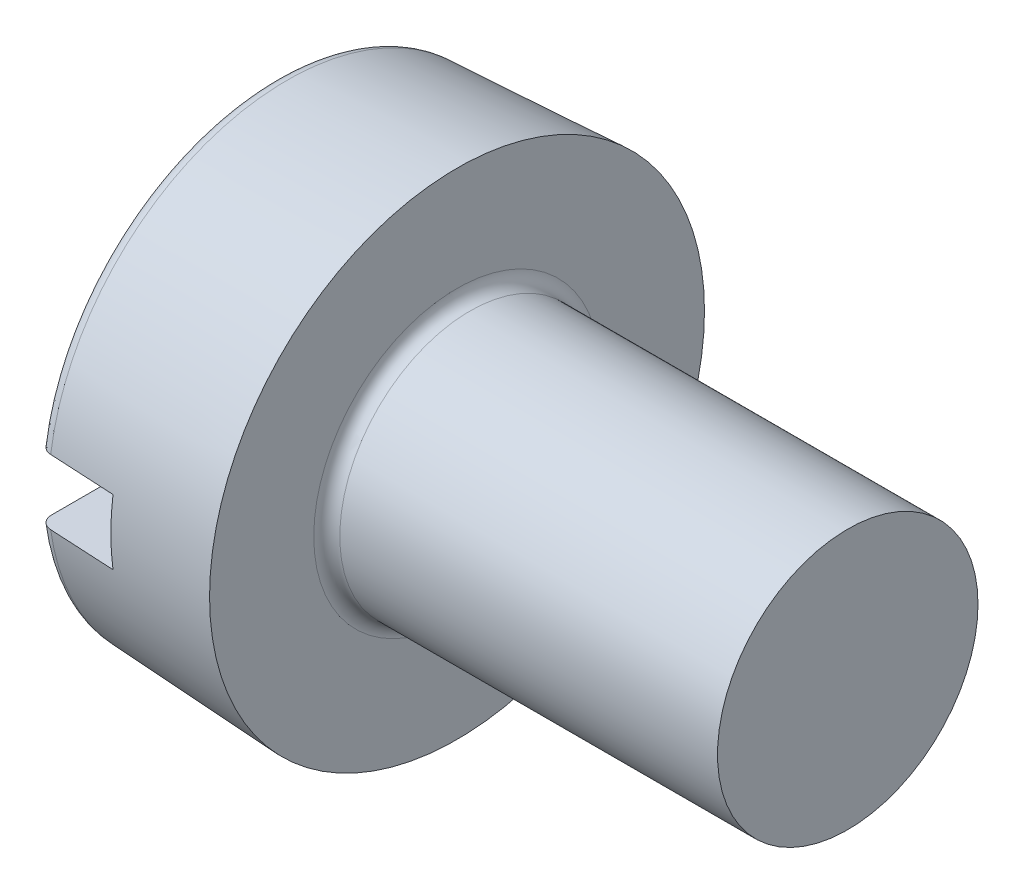
ISO-10303-21;
HEADER;
FILE_DESCRIPTION(('STEP AP214'),'2;1');
FILE_NAME('part.step','',(''),(''),'','','');
FILE_SCHEMA(('AUTOMOTIVE_DESIGN { 1 0 10303 214 1 1 1 1 }'));
ENDSEC;
DATA;
#1=APPLICATION_CONTEXT('core data for automotive mechanical design processes');
#2=APPLICATION_PROTOCOL_DEFINITION('international standard','automotive_design',2000,#1);
#3=PRODUCT_CONTEXT('',#1,'mechanical');
#4=PRODUCT('Part','Part','',(#3));
#5=PRODUCT_RELATED_PRODUCT_CATEGORY('part','',(#4));
#6=PRODUCT_DEFINITION_FORMATION('','',#4);
#7=PRODUCT_DEFINITION_CONTEXT('part definition',#1,'design');
#8=PRODUCT_DEFINITION('design','',#6,#7);
#9=PRODUCT_DEFINITION_SHAPE('','',#8);
#10=(LENGTH_UNIT() NAMED_UNIT(*) SI_UNIT(.MILLI.,.METRE.));
#11=(NAMED_UNIT(*) PLANE_ANGLE_UNIT() SI_UNIT($,.RADIAN.));
#12=(NAMED_UNIT(*) SI_UNIT($,.STERADIAN.) SOLID_ANGLE_UNIT());
#13=UNCERTAINTY_MEASURE_WITH_UNIT(LENGTH_MEASURE(1.E-05),#10,'distance_accuracy_value','');
#14=(GEOMETRIC_REPRESENTATION_CONTEXT(3) GLOBAL_UNCERTAINTY_ASSIGNED_CONTEXT((#13)) GLOBAL_UNIT_ASSIGNED_CONTEXT((#10,
#11,#12)) REPRESENTATION_CONTEXT('',''));
#15=CARTESIAN_POINT('',(0.,0.,0.));
#16=DIRECTION('',(0.,0.,1.));
#17=DIRECTION('',(1.,0.,0.));
#18=AXIS2_PLACEMENT_3D('',#15,#16,#17);
#19=CARTESIAN_POINT('',(0.,0.,0.));
#20=DIRECTION('',(1.,0.,0.));
#21=DIRECTION('',(0.,0.,-1.));
#22=AXIS2_PLACEMENT_3D('',#19,#20,#21);
#23=PLANE('',#22);
#24=DIRECTION('',(0.,0.,-1.));
#25=VECTOR('',#24,1.);
#26=CARTESIAN_POINT('',(0.,-0.25,0.));
#27=LINE('',#26,#25);
#28=CARTESIAN_POINT('',(0.,-0.25,1.71359212741939));
#29=VERTEX_POINT('',#28);
#30=CARTESIAN_POINT('',(0.,-0.25,-1.71359212741939));
#31=VERTEX_POINT('',#30);
#32=EDGE_CURVE('E123',#29,#31,#27,.T.);
#33=ORIENTED_EDGE('',*,*,#32,.T.);
#34=CARTESIAN_POINT('',(0.,0.,0.));
#35=DIRECTION('',(1.,0.,0.));
#36=DIRECTION('',(0.,0.,-1.));
#37=AXIS2_PLACEMENT_3D('',#34,#35,#36);
#38=CIRCLE('',#37,1.73173265233225);
#39=EDGE_CURVE('E212',#31,#29,#38,.F.);
#40=ORIENTED_EDGE('',*,*,#39,.T.);
#41=EDGE_LOOP('',(#33,#40));
#42=FACE_BOUND('',#41,.T.);
#43=ADVANCED_FACE('F43',(#42),#23,.F.);
#44=CARTESIAN_POINT('',(1.4,0.,0.));
#45=DIRECTION('',(1.,0.,0.));
#46=DIRECTION('',(0.,0.,-1.));
#47=AXIS2_PLACEMENT_3D('',#44,#45,#46);
#48=PLANE('',#47);
#49=CARTESIAN_POINT('',(1.4,0.,0.));
#50=DIRECTION('',(1.,0.,0.));
#51=DIRECTION('',(0.,0.,-1.));
#52=AXIS2_PLACEMENT_3D('',#49,#50,#51);
#53=CIRCLE('',#52,1.1);
#54=CARTESIAN_POINT('',(1.4,0.,-1.1));
#55=VERTEX_POINT('',#54);
#56=EDGE_CURVE('E133',#55,#55,#53,.F.);
#57=ORIENTED_EDGE('',*,*,#56,.T.);
#58=EDGE_LOOP('',(#57));
#59=FACE_BOUND('',#58,.T.);
#60=CARTESIAN_POINT('',(1.4,0.,0.));
#61=DIRECTION('',(1.,0.,0.));
#62=DIRECTION('',(0.,0.,-1.));
#63=AXIS2_PLACEMENT_3D('',#60,#61,#62);
#64=CIRCLE('',#63,1.9);
#65=CARTESIAN_POINT('',(1.4,0.,-1.9));
#66=VERTEX_POINT('',#65);
#67=EDGE_CURVE('E242',#66,#66,#64,.T.);
#68=ORIENTED_EDGE('',*,*,#67,.T.);
#69=EDGE_LOOP('',(#68));
#70=FACE_BOUND('',#69,.T.);
#71=ADVANCED_FACE('F186',(#59,#70),#48,.T.);
#72=CARTESIAN_POINT('',(1.4,0.,0.));
#73=DIRECTION('',(1.,0.,0.));
#74=DIRECTION('',(0.,0.,-1.));
#75=AXIS2_PLACEMENT_3D('',#72,#73,#74);
#76=CONICAL_SURFACE('',#75,1.9,0.05235987755983);
#77=CARTESIAN_POINT('',(-3.21567537978676,-0.25,1.63914751477753));
#78=CARTESIAN_POINT('',(-2.05086502036169,-0.25,1.70088544535187));
#79=CARTESIAN_POINT('',(-0.886051593062713,-0.25,1.76256538506105));
#80=CARTESIAN_POINT('',(1.4435813966979,-0.25,1.88580928271814));
#81=CARTESIAN_POINT('',(2.60840095915954,-0.25,1.94737324066612));
#82=CARTESIAN_POINT('',(3.77322358949508,-0.25,2.00887920774899));
#83=B_SPLINE_CURVE_WITH_KNOTS('',3,(#77,#78,#79,#80,#81,#82),.UNSPECIFIED.,.F.,.F.,(4,2,4),(0.,
3.49933602536346,6.99867204896907),.UNSPECIFIED.);
#84=CARTESIAN_POINT('',(0.0947664043757051,-0.25,1.81445376441896));
#85=VERTEX_POINT('',#84);
#86=CARTESIAN_POINT('',(0.600000000000001,-0.25,1.84117847021693));
#87=VERTEX_POINT('',#86);
#88=EDGE_CURVE('E104',#85,#87,#83,.T.);
#89=ORIENTED_EDGE('',*,*,#88,.F.);
#90=CARTESIAN_POINT('',(0.0947664043757056,0.,0.));
#91=DIRECTION('',(1.,0.,0.));
#92=DIRECTION('',(0.,0.,-1.));
#93=AXIS2_PLACEMENT_3D('',#90,#91,#92);
#94=CIRCLE('',#93,1.83159560580771);
#95=CARTESIAN_POINT('',(0.0947664043757057,-0.25,-1.81445376441896));
#96=VERTEX_POINT('',#95);
#97=EDGE_CURVE('E138',#85,#96,#94,.T.);
#98=ORIENTED_EDGE('',*,*,#97,.T.);
#99=CARTESIAN_POINT('',(3.77322358949508,-0.25,-2.00887920774899));
#100=CARTESIAN_POINT('',(2.60840095915954,-0.25,-1.94737324066612));
#101=CARTESIAN_POINT('',(1.4435813966979,-0.25,-1.88580928271814));
#102=CARTESIAN_POINT('',(-0.886051593062713,-0.25,-1.76256538506105));
#103=CARTESIAN_POINT('',(-2.05086502036169,-0.25,-1.70088544535187));
#104=CARTESIAN_POINT('',(-3.21567537978676,-0.25,-1.63914751477753));
#105=B_SPLINE_CURVE_WITH_KNOTS('',3,(#99,#100,#101,#102,#103,#104),.UNSPECIFIED.,.F.,.F.,(4,2,
4),(0.,3.4993360236056,6.99867204896907),.UNSPECIFIED.);
#106=CARTESIAN_POINT('',(0.600000000000001,-0.25,-1.84117847021693));
#107=VERTEX_POINT('',#106);
#108=EDGE_CURVE('E122',#107,#96,#105,.T.);
#109=ORIENTED_EDGE('',*,*,#108,.F.);
#110=CARTESIAN_POINT('',(0.600000000000001,0.,0.));
#111=DIRECTION('',(1.,0.,0.));
#112=DIRECTION('',(0.,0.,-1.));
#113=AXIS2_PLACEMENT_3D('',#110,#111,#112);
#114=CIRCLE('',#113,1.85807377657357);
#115=CARTESIAN_POINT('',(0.600000000000001,0.250000000000001,-1.84117847021693));
#116=VERTEX_POINT('',#115);
#117=EDGE_CURVE('E110',#116,#107,#114,.F.);
#118=ORIENTED_EDGE('',*,*,#117,.F.);
#119=CARTESIAN_POINT('',(-3.21567537978676,0.249999999999998,-1.63914751477753));
#120=CARTESIAN_POINT('',(-2.05086502036169,0.249999999999999,-1.70088544535187));
#121=CARTESIAN_POINT('',(-0.886051593062713,0.25,-1.76256538506105));
#122=CARTESIAN_POINT('',(1.4435813966979,0.250000000000001,-1.88580928271814));
#123=CARTESIAN_POINT('',(2.60840095915954,0.250000000000002,-1.94737324066612));
#124=CARTESIAN_POINT('',(3.77322358949508,0.250000000000003,-2.00887920774899));
#125=B_SPLINE_CURVE_WITH_KNOTS('',3,(#119,#120,#121,#122,#123,#124),.UNSPECIFIED.,.F.,.F.,(4,2,
4),(0.,3.49933602536346,6.99867204896907),.UNSPECIFIED.);
#126=CARTESIAN_POINT('',(0.0947664043757051,0.25,-1.81445376441896));
#127=VERTEX_POINT('',#126);
#128=EDGE_CURVE('E93',#127,#116,#125,.T.);
#129=ORIENTED_EDGE('',*,*,#128,.F.);
#130=CARTESIAN_POINT('',(0.0947664043757057,0.,0.));
#131=DIRECTION('',(1.,0.,0.));
#132=DIRECTION('',(0.,0.,-1.));
#133=AXIS2_PLACEMENT_3D('',#130,#131,#132);
#134=CIRCLE('',#133,1.83159560580771);
#135=CARTESIAN_POINT('',(0.0947664043757057,0.25,1.81445376441896));
#136=VERTEX_POINT('',#135);
#137=EDGE_CURVE('E136',#127,#136,#134,.T.);
#138=ORIENTED_EDGE('',*,*,#137,.T.);
#139=CARTESIAN_POINT('',(3.77322358949508,0.250000000000003,2.00887920774899));
#140=CARTESIAN_POINT('',(2.60840095915954,0.250000000000002,1.94737324066612));
#141=CARTESIAN_POINT('',(1.4435813966979,0.250000000000001,1.88580928271814));
#142=CARTESIAN_POINT('',(-0.886051593062713,0.25,1.76256538506105));
#143=CARTESIAN_POINT('',(-2.05086502036169,0.249999999999999,1.70088544535187));
#144=CARTESIAN_POINT('',(-3.21567537978676,0.249999999999998,1.63914751477753));
#145=B_SPLINE_CURVE_WITH_KNOTS('',3,(#139,#140,#141,#142,#143,#144),.UNSPECIFIED.,.F.,.F.,(4,2,
4),(0.,3.4993360236056,6.99867204896907),.UNSPECIFIED.);
#146=CARTESIAN_POINT('',(0.600000000000001,0.250000000000001,1.84117847021693));
#147=VERTEX_POINT('',#146);
#148=EDGE_CURVE('E105',#147,#136,#145,.T.);
#149=ORIENTED_EDGE('',*,*,#148,.F.);
#150=EDGE_CURVE('E113',#87,#147,#114,.F.);
#151=ORIENTED_EDGE('',*,*,#150,.F.);
#152=EDGE_LOOP('',(#89,#98,#109,#118,#129,#138,#149,#151));
#153=FACE_BOUND('',#152,.T.);
#154=ORIENTED_EDGE('',*,*,#67,.F.);
#155=EDGE_LOOP('',(#154));
#156=FACE_BOUND('',#155,.T.);
#157=ADVANCED_FACE('F118',(#153,#156),#76,.T.);
#158=DIRECTION('',(0.,0.,1.));
#159=VECTOR('',#158,1.);
#160=CARTESIAN_POINT('',(0.,0.25,0.));
#161=LINE('',#160,#159);
#162=CARTESIAN_POINT('',(0.,0.25,-1.71359212741939));
#163=VERTEX_POINT('',#162);
#164=CARTESIAN_POINT('',(0.,0.25,1.71359212741939));
#165=VERTEX_POINT('',#164);
#166=EDGE_CURVE('E127',#163,#165,#161,.T.);
#167=ORIENTED_EDGE('',*,*,#166,.T.);
#168=CARTESIAN_POINT('',(0.,0.,0.));
#169=DIRECTION('',(1.,0.,0.));
#170=DIRECTION('',(0.,0.,-1.));
#171=AXIS2_PLACEMENT_3D('',#168,#169,#170);
#172=CIRCLE('',#171,1.73173265233225);
#173=EDGE_CURVE('E11',#165,#163,#172,.F.);
#174=ORIENTED_EDGE('',*,*,#173,.T.);
#175=EDGE_LOOP('',(#167,#174));
#176=FACE_BOUND('',#175,.T.);
#177=ADVANCED_FACE('F185',(#176),#23,.F.);
#178=CARTESIAN_POINT('',(4.39999999990914,0.,0.));
#179=DIRECTION('',(-1.,0.,0.));
#180=DIRECTION('',(0.,0.,1.));
#181=AXIS2_PLACEMENT_3D('',#178,#179,#180);
#182=CYLINDRICAL_SURFACE('',#181,1.);
#183=CARTESIAN_POINT('',(1.5,0.,0.));
#184=DIRECTION('',(1.,0.,0.));
#185=DIRECTION('',(0.,0.,-1.));
#186=AXIS2_PLACEMENT_3D('',#183,#184,#185);
#187=CIRCLE('',#186,1.);
#188=CARTESIAN_POINT('',(1.5,0.,-1.));
#189=VERTEX_POINT('',#188);
#190=EDGE_CURVE('E125',#189,#189,#187,.T.);
#191=ORIENTED_EDGE('',*,*,#190,.T.);
#192=EDGE_LOOP('',(#191));
#193=FACE_BOUND('',#192,.T.);
#194=CARTESIAN_POINT('',(4.39999999990914,0.,0.));
#195=DIRECTION('',(1.,0.,0.));
#196=DIRECTION('',(0.,0.,-1.));
#197=AXIS2_PLACEMENT_3D('',#194,#195,#196);
#198=CIRCLE('',#197,1.);
#199=CARTESIAN_POINT('',(4.39999999990914,0.,-1.));
#200=VERTEX_POINT('',#199);
#201=EDGE_CURVE('E180',#200,#200,#198,.T.);
#202=ORIENTED_EDGE('',*,*,#201,.F.);
#203=EDGE_LOOP('',(#202));
#204=FACE_BOUND('',#203,.T.);
#205=ADVANCED_FACE('F236',(#193,#204),#182,.T.);
#206=CARTESIAN_POINT('',(4.39999999990914,0.,0.));
#207=DIRECTION('',(1.,0.,0.));
#208=DIRECTION('',(0.,0.,-1.));
#209=AXIS2_PLACEMENT_3D('',#206,#207,#208);
#210=PLANE('',#209);
#211=ORIENTED_EDGE('',*,*,#201,.T.);
#212=EDGE_LOOP('',(#211));
#213=FACE_BOUND('',#212,.T.);
#214=ADVANCED_FACE('F161',(#213),#210,.T.);
#215=CARTESIAN_POINT('',(0.,-0.25,-1.9));
#216=DIRECTION('',(0.,-1.,0.));
#217=DIRECTION('',(0.,0.,-1.));
#218=AXIS2_PLACEMENT_3D('',#215,#216,#217);
#219=PLANE('',#218);
#220=ORIENTED_EDGE('',*,*,#108,.T.);
#221=CARTESIAN_POINT('',(0.0947664043757056,-0.25,-1.81445376441896));
#222=CARTESIAN_POINT('',(0.0891826687362408,-0.25,-1.81416335485054));
#223=CARTESIAN_POINT('',(0.0836262491473391,-0.25,-1.81339073615339));
#224=CARTESIAN_POINT('',(0.072726697061144,-0.25,-1.81092711636769));
#225=CARTESIAN_POINT('',(0.0673833481120231,-0.25,-1.80923707416551));
#226=CARTESIAN_POINT('',(0.0570543619121599,-0.25,-1.80498304949776));
#227=CARTESIAN_POINT('',(0.0520688600256406,-0.25,-1.80241873840614));
#228=CARTESIAN_POINT('',(0.0425971860789267,-0.25,-1.79649384930149));
#229=CARTESIAN_POINT('',(0.0381109504345842,-0.25,-1.7931333728552));
#230=CARTESIAN_POINT('',(0.0297415446577998,-0.25,-1.7856965174859));
#231=CARTESIAN_POINT('',(0.0258611474133915,-0.25,-1.78161701890762));
#232=CARTESIAN_POINT('',(0.0188316875714826,-0.25,-1.77286833494573));
#233=CARTESIAN_POINT('',(0.0156828595570497,-0.25,-1.76819896115319));
#234=CARTESIAN_POINT('',(0.0101755291981941,-0.25,-1.75835742758744));
#235=CARTESIAN_POINT('',(0.00782484562132172,-0.25,-1.75318089986149));
#236=CARTESIAN_POINT('',(0.00401923998413812,-0.25,-1.74251092238898));
#237=CARTESIAN_POINT('',(0.00256356091209223,-0.25,-1.73701774478472));
#238=CARTESIAN_POINT('',(0.00104942200714041,-0.25,-1.72849838575077));
#239=CARTESIAN_POINT('',(0.000655809314446682,-0.25,-1.72552803133571));
#240=CARTESIAN_POINT('',(0.000131327407499298,-0.25,-1.71956959119094));
#241=CARTESIAN_POINT('',(-1.27238959071228E-08,-0.25,-1.71658154692045));
#242=CARTESIAN_POINT('',(0.,-0.25,-1.71359212741939));
#243=B_SPLINE_CURVE_WITH_KNOTS('',3,(#221,#222,#223,#224,#225,#226,#227,#228,#229,#230,#231,
#232,#233,#234,#235,#236,#237,#238,#239,#240,#241,#242),.UNSPECIFIED.,.F.,.F.,(4,2,2,2,2,2,2,2,
2,2,4),(0.,0.0167508037425343,0.033484133246153,0.0502237595332963,0.0669612514965605,
0.0837732359149249,0.100590603802513,0.117568260677029,0.134531537702122,0.143510313276149,
0.152472952679072),.UNSPECIFIED.);
#244=EDGE_CURVE('E147',#96,#31,#243,.T.);
#245=ORIENTED_EDGE('',*,*,#244,.T.);
#246=ORIENTED_EDGE('',*,*,#32,.F.);
#247=CARTESIAN_POINT('',(0.,-0.25,1.71359212741939));
#248=CARTESIAN_POINT('',(-4.6045006095408E-06,-0.25,1.71931701938227));
#249=CARTESIAN_POINT('',(0.000481106702233268,-0.25,1.72504091954525));
#250=CARTESIAN_POINT('',(0.00240035198341133,-0.25,1.73632514188921));
#251=CARTESIAN_POINT('',(0.00383347560504802,-0.25,1.74188553381933));
#252=CARTESIAN_POINT('',(0.0076159449599381,-0.25,1.75268967859914));
#253=CARTESIAN_POINT('',(0.00996585011730522,-0.25,1.75793323585441));
#254=CARTESIAN_POINT('',(0.0155161878694702,-0.25,1.76794713424164));
#255=CARTESIAN_POINT('',(0.0187163580842748,-0.25,1.7727176207341));
#256=CARTESIAN_POINT('',(0.0258606800524882,-0.25,1.78162348156563));
#257=CARTESIAN_POINT('',(0.0298008446545696,-0.25,1.78576205352265));
#258=CARTESIAN_POINT('',(0.0383275658235491,-0.25,1.79331261668082));
#259=CARTESIAN_POINT('',(0.0429143138855093,-0.25,1.79672439187614));
#260=CARTESIAN_POINT('',(0.0525568050790698,-0.25,1.8026891286638));
#261=CARTESIAN_POINT('',(0.0576078683497738,-0.25,1.80524966929933));
#262=CARTESIAN_POINT('',(0.0680682081644748,-0.25,1.80947572580937));
#263=CARTESIAN_POINT('',(0.0734770672568874,-0.25,1.8111422647541));
#264=CARTESIAN_POINT('',(0.081581972914116,-0.25,1.81290164061657));
#265=CARTESIAN_POINT('',(0.084203194820768,-0.25,1.81336083203981));
#266=CARTESIAN_POINT('',(0.0894694684354647,-0.25,1.81406653757698));
#267=CARTESIAN_POINT('',(0.092114470701494,-0.25,1.81431342062914));
#268=CARTESIAN_POINT('',(0.0947664043757042,-0.25,1.81445376441896));
#269=B_SPLINE_CURVE_WITH_KNOTS('',3,(#247,#248,#249,#250,#251,#252,#253,#254,#255,#256,#257,
#258,#259,#260,#261,#262,#263,#264,#265,#266,#267,#268),.UNSPECIFIED.,.F.,.F.,(4,2,2,2,2,2,2,2,
2,2,4),(0.,0.0171527559094524,0.0342980854294006,0.0514538935096251,0.0686044136819732,
0.0856650470616208,0.102730743852283,0.119640149342859,0.136530162683885,0.144506270261185,
0.152468489209884),.UNSPECIFIED.);
#270=EDGE_CURVE('E140',#29,#85,#269,.T.);
#271=ORIENTED_EDGE('',*,*,#270,.T.);
#272=ORIENTED_EDGE('',*,*,#88,.T.);
#273=DIRECTION('',(0.,0.,1.));
#274=VECTOR('',#273,1.);
#275=CARTESIAN_POINT('',(0.6,-0.25,-1.9));
#276=LINE('',#275,#274);
#277=EDGE_CURVE('E114',#107,#87,#276,.T.);
#278=ORIENTED_EDGE('',*,*,#277,.F.);
#279=EDGE_LOOP('',(#220,#245,#246,#271,#272,#278));
#280=FACE_BOUND('',#279,.T.);
#281=ADVANCED_FACE('F156',(#280),#219,.F.);
#282=CARTESIAN_POINT('',(0.,0.25,-1.9));
#283=DIRECTION('',(0.,1.,0.));
#284=DIRECTION('',(-1.,0.,0.));
#285=AXIS2_PLACEMENT_3D('',#282,#283,#284);
#286=PLANE('',#285);
#287=ORIENTED_EDGE('',*,*,#148,.T.);
#288=CARTESIAN_POINT('',(0.0947664043757056,0.25,1.81445376441896));
#289=CARTESIAN_POINT('',(0.0891826687362409,0.25,1.81416335485054));
#290=CARTESIAN_POINT('',(0.0836262491473392,0.25,1.81339073615339));
#291=CARTESIAN_POINT('',(0.0727266970611439,0.25,1.81092711636769));
#292=CARTESIAN_POINT('',(0.067383348112023,0.25,1.80923707416551));
#293=CARTESIAN_POINT('',(0.0570543619121598,0.25,1.80498304949776));
#294=CARTESIAN_POINT('',(0.0520688600256407,0.25,1.80241873840614));
#295=CARTESIAN_POINT('',(0.0425971860789267,0.25,1.79649384930149));
#296=CARTESIAN_POINT('',(0.0381109504345841,0.25,1.7931333728552));
#297=CARTESIAN_POINT('',(0.0297415446577997,0.25,1.7856965174859));
#298=CARTESIAN_POINT('',(0.0258611474133915,0.25,1.78161701890762));
#299=CARTESIAN_POINT('',(0.0188316875714826,0.25,1.77286833494573));
#300=CARTESIAN_POINT('',(0.0156828595570496,0.25,1.76819896115319));
#301=CARTESIAN_POINT('',(0.0101755291981939,0.25,1.75835742758744));
#302=CARTESIAN_POINT('',(0.00782484562132156,0.25,1.75318089986149));
#303=CARTESIAN_POINT('',(0.00401923998413805,0.25,1.74251092238898));
#304=CARTESIAN_POINT('',(0.00256356091209222,0.25,1.73701774478472));
#305=CARTESIAN_POINT('',(0.00104942200714042,0.25,1.72849838575077));
#306=CARTESIAN_POINT('',(0.000655809314446684,0.25,1.72552803133571));
#307=CARTESIAN_POINT('',(0.000131327407499294,0.25,1.71956959119094));
#308=CARTESIAN_POINT('',(-1.27238959167938E-08,0.25,1.71658154692045));
#309=CARTESIAN_POINT('',(0.,0.25,1.71359212741939));
#310=B_SPLINE_CURVE_WITH_KNOTS('',3,(#288,#289,#290,#291,#292,#293,#294,#295,#296,#297,#298,
#299,#300,#301,#302,#303,#304,#305,#306,#307,#308,#309),.UNSPECIFIED.,.F.,.F.,(4,2,2,2,2,2,2,2,
2,2,4),(0.,0.0167508037425343,0.033484133246153,0.0502237595332964,0.0669612514965606,
0.0837732359149252,0.100590603802513,0.11756826067703,0.134531537702122,0.143510313276149,
0.152472952679072),.UNSPECIFIED.);
#311=EDGE_CURVE('E52',#136,#165,#310,.T.);
#312=ORIENTED_EDGE('',*,*,#311,.T.);
#313=ORIENTED_EDGE('',*,*,#166,.F.);
#314=CARTESIAN_POINT('',(0.,0.25,-1.71359212741939));
#315=CARTESIAN_POINT('',(-4.60450060953191E-06,0.25,-1.71931701938227));
#316=CARTESIAN_POINT('',(0.000481106702233275,0.25,-1.72504091954525));
#317=CARTESIAN_POINT('',(0.00240035198341133,0.25,-1.73632514188921));
#318=CARTESIAN_POINT('',(0.00383347560504801,0.25,-1.74188553381933));
#319=CARTESIAN_POINT('',(0.00761594495993811,0.25,-1.75268967859914));
#320=CARTESIAN_POINT('',(0.00996585011730524,0.25,-1.75793323585441));
#321=CARTESIAN_POINT('',(0.0155161878694702,0.25,-1.76794713424164));
#322=CARTESIAN_POINT('',(0.0187163580842749,0.25,-1.7727176207341));
#323=CARTESIAN_POINT('',(0.0258606800524883,0.25,-1.78162348156563));
#324=CARTESIAN_POINT('',(0.0298008446545697,0.25,-1.78576205352265));
#325=CARTESIAN_POINT('',(0.0383275658235492,0.25,-1.79331261668082));
#326=CARTESIAN_POINT('',(0.0429143138855094,0.25,-1.79672439187614));
#327=CARTESIAN_POINT('',(0.0525568050790699,0.25,-1.8026891286638));
#328=CARTESIAN_POINT('',(0.0576078683497739,0.25,-1.80524966929933));
#329=CARTESIAN_POINT('',(0.0680682081644749,0.25,-1.80947572580937));
#330=CARTESIAN_POINT('',(0.0734770672568876,0.25,-1.8111422647541));
#331=CARTESIAN_POINT('',(0.0815819729141161,0.25,-1.81290164061657));
#332=CARTESIAN_POINT('',(0.0842031948207681,0.25,-1.81336083203981));
#333=CARTESIAN_POINT('',(0.0894694684354647,0.25,-1.81406653757698));
#334=CARTESIAN_POINT('',(0.092114470701494,0.25,-1.81431342062914));
#335=CARTESIAN_POINT('',(0.0947664043757042,0.25,-1.81445376441896));
#336=B_SPLINE_CURVE_WITH_KNOTS('',3,(#314,#315,#316,#317,#318,#319,#320,#321,#322,#323,#324,
#325,#326,#327,#328,#329,#330,#331,#332,#333,#334,#335),.UNSPECIFIED.,.F.,.F.,(4,2,2,2,2,2,2,2,
2,2,4),(0.,0.0171527559094524,0.0342980854294006,0.0514538935096251,0.0686044136819732,
0.0856650470616209,0.102730743852283,0.119640149342859,0.136530162683885,0.144506270261185,
0.152468489209884),.UNSPECIFIED.);
#337=EDGE_CURVE('E99',#163,#127,#336,.T.);
#338=ORIENTED_EDGE('',*,*,#337,.T.);
#339=ORIENTED_EDGE('',*,*,#128,.T.);
#340=DIRECTION('',(0.,0.,1.));
#341=VECTOR('',#340,1.);
#342=CARTESIAN_POINT('',(0.6,0.250000000000001,-1.9));
#343=LINE('',#342,#341);
#344=EDGE_CURVE('E96',#116,#147,#343,.T.);
#345=ORIENTED_EDGE('',*,*,#344,.T.);
#346=EDGE_LOOP('',(#287,#312,#313,#338,#339,#345));
#347=FACE_BOUND('',#346,.T.);
#348=ADVANCED_FACE('F95',(#347),#286,.F.);
#349=CARTESIAN_POINT('',(0.6,-0.25,-1.9));
#350=DIRECTION('',(1.,0.,0.));
#351=DIRECTION('',(0.,0.,-1.));
#352=AXIS2_PLACEMENT_3D('',#349,#350,#351);
#353=PLANE('',#352);
#354=ORIENTED_EDGE('',*,*,#150,.T.);
#355=ORIENTED_EDGE('',*,*,#344,.F.);
#356=ORIENTED_EDGE('',*,*,#117,.T.);
#357=ORIENTED_EDGE('',*,*,#277,.T.);
#358=EDGE_LOOP('',(#354,#355,#356,#357));
#359=FACE_BOUND('',#358,.T.);
#360=ADVANCED_FACE('F108',(#359),#353,.F.);
#361=CARTESIAN_POINT('',(1.5,0.,0.));
#362=DIRECTION('',(1.,0.,0.));
#363=DIRECTION('',(0.,0.,-1.));
#364=AXIS2_PLACEMENT_3D('',#361,#362,#363);
#365=TOROIDAL_SURFACE('',#364,1.1,0.1);
#366=ORIENTED_EDGE('',*,*,#56,.F.);
#367=EDGE_LOOP('',(#366));
#368=FACE_BOUND('',#367,.T.);
#369=ORIENTED_EDGE('',*,*,#190,.F.);
#370=EDGE_LOOP('',(#369));
#371=FACE_BOUND('',#370,.T.);
#372=ADVANCED_FACE('F188',(#368,#371),#365,.F.);
#373=CARTESIAN_POINT('',(0.1,0.,0.));
#374=DIRECTION('',(1.,0.,0.));
#375=DIRECTION('',(0.,0.,-1.));
#376=AXIS2_PLACEMENT_3D('',#373,#374,#375);
#377=TOROIDAL_SURFACE('',#376,1.73173265233225,0.1);
#378=ORIENTED_EDGE('',*,*,#270,.F.);
#379=ORIENTED_EDGE('',*,*,#39,.F.);
#380=ORIENTED_EDGE('',*,*,#244,.F.);
#381=ORIENTED_EDGE('',*,*,#97,.F.);
#382=EDGE_LOOP('',(#378,#379,#380,#381));
#383=FACE_BOUND('',#382,.T.);
#384=ADVANCED_FACE('F153',(#383),#377,.T.);
#385=CARTESIAN_POINT('',(0.1,0.,0.));
#386=DIRECTION('',(1.,0.,0.));
#387=DIRECTION('',(0.,0.,-1.));
#388=AXIS2_PLACEMENT_3D('',#385,#386,#387);
#389=TOROIDAL_SURFACE('',#388,1.73173265233225,0.1);
#390=ORIENTED_EDGE('',*,*,#337,.F.);
#391=ORIENTED_EDGE('',*,*,#173,.F.);
#392=ORIENTED_EDGE('',*,*,#311,.F.);
#393=ORIENTED_EDGE('',*,*,#137,.F.);
#394=EDGE_LOOP('',(#390,#391,#392,#393));
#395=FACE_BOUND('',#394,.T.);
#396=ADVANCED_FACE('F45',(#395),#389,.T.);
#397=CLOSED_SHELL('',(#43,#71,#157,#177,#205,#214,#281,#348,#360,#372,#384,#396));
#398=MANIFOLD_SOLID_BREP('B2',#397);
#399=ADVANCED_BREP_SHAPE_REPRESENTATION('',(#18,#398),#14);
#400=SHAPE_DEFINITION_REPRESENTATION(#9,#399);
ENDSEC;
END-ISO-10303-21;
